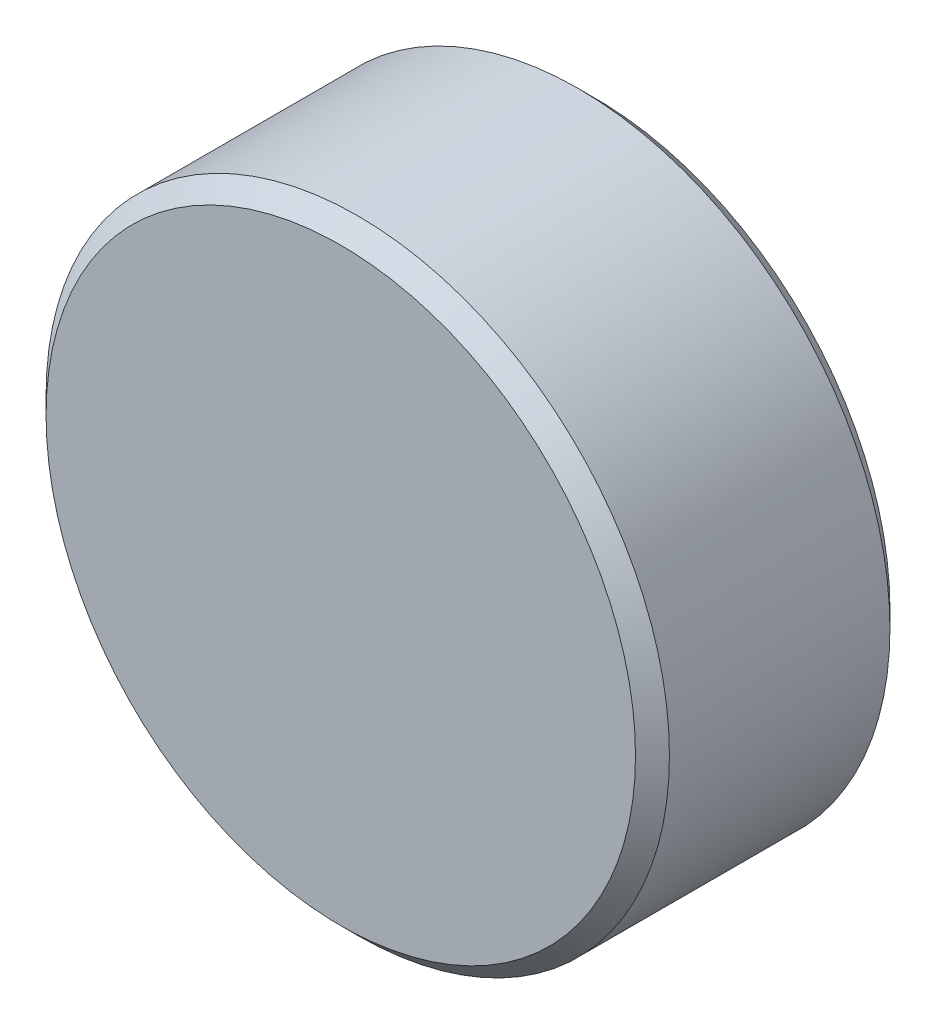
ISO-10303-21;
HEADER;
FILE_DESCRIPTION(('STEP AP214'),'2;1');
FILE_NAME('part.step','',(''),(''),'','','');
FILE_SCHEMA(('AUTOMOTIVE_DESIGN { 1 0 10303 214 1 1 1 1 }'));
ENDSEC;
DATA;
#1=APPLICATION_CONTEXT('core data for automotive mechanical design processes');
#2=APPLICATION_PROTOCOL_DEFINITION('international standard','automotive_design',2000,#1);
#3=PRODUCT_CONTEXT('',#1,'mechanical');
#4=PRODUCT('Part','Part','',(#3));
#5=PRODUCT_RELATED_PRODUCT_CATEGORY('part','',(#4));
#6=PRODUCT_DEFINITION_FORMATION('','',#4);
#7=PRODUCT_DEFINITION_CONTEXT('part definition',#1,'design');
#8=PRODUCT_DEFINITION('design','',#6,#7);
#9=PRODUCT_DEFINITION_SHAPE('','',#8);
#10=(LENGTH_UNIT() NAMED_UNIT(*) SI_UNIT(.MILLI.,.METRE.));
#11=(NAMED_UNIT(*) PLANE_ANGLE_UNIT() SI_UNIT($,.RADIAN.));
#12=(NAMED_UNIT(*) SI_UNIT($,.STERADIAN.) SOLID_ANGLE_UNIT());
#13=UNCERTAINTY_MEASURE_WITH_UNIT(LENGTH_MEASURE(1.E-05),#10,'distance_accuracy_value','');
#14=(GEOMETRIC_REPRESENTATION_CONTEXT(3) GLOBAL_UNCERTAINTY_ASSIGNED_CONTEXT((#13)) GLOBAL_UNIT_ASSIGNED_CONTEXT((#10,
#11,#12)) REPRESENTATION_CONTEXT('',''));
#15=CARTESIAN_POINT('',(0.,0.,0.));
#16=DIRECTION('',(0.,0.,1.));
#17=DIRECTION('',(1.,0.,0.));
#18=AXIS2_PLACEMENT_3D('',#15,#16,#17);
#19=CARTESIAN_POINT('',(0.,0.,30.));
#20=DIRECTION('',(0.,0.,-1.));
#21=DIRECTION('',(-1.,0.,0.));
#22=AXIS2_PLACEMENT_3D('',#19,#20,#21);
#23=CYLINDRICAL_SURFACE('',#22,36.75);
#24=CARTESIAN_POINT('',(0.,0.,2.00000000000001));
#25=DIRECTION('',(0.,0.,1.));
#26=DIRECTION('',(1.,0.,0.));
#27=AXIS2_PLACEMENT_3D('',#24,#25,#26);
#28=CIRCLE('',#27,36.75);
#29=CARTESIAN_POINT('',(36.75,0.,2.00000000000001));
#30=VERTEX_POINT('',#29);
#31=EDGE_CURVE('E35',#30,#30,#28,.T.);
#32=ORIENTED_EDGE('',*,*,#31,.T.);
#33=EDGE_LOOP('',(#32));
#34=FACE_BOUND('',#33,.T.);
#35=CARTESIAN_POINT('',(0.,0.,28.));
#36=DIRECTION('',(0.,0.,1.));
#37=DIRECTION('',(1.,0.,0.));
#38=AXIS2_PLACEMENT_3D('',#35,#36,#37);
#39=CIRCLE('',#38,36.75);
#40=CARTESIAN_POINT('',(36.75,0.,28.));
#41=VERTEX_POINT('',#40);
#42=EDGE_CURVE('E39',#41,#41,#39,.F.);
#43=ORIENTED_EDGE('',*,*,#42,.T.);
#44=EDGE_LOOP('',(#43));
#45=FACE_BOUND('',#44,.T.);
#46=ADVANCED_FACE('F28',(#34,#45),#23,.T.);
#47=CARTESIAN_POINT('',(0.,0.,30.));
#48=DIRECTION('',(0.,0.,1.));
#49=DIRECTION('',(1.,0.,0.));
#50=AXIS2_PLACEMENT_3D('',#47,#48,#49);
#51=PLANE('',#50);
#52=CARTESIAN_POINT('',(0.,0.,30.));
#53=DIRECTION('',(0.,0.,1.));
#54=DIRECTION('',(1.,0.,0.));
#55=AXIS2_PLACEMENT_3D('',#52,#53,#54);
#56=CIRCLE('',#55,34.75);
#57=CARTESIAN_POINT('',(34.75,0.,30.));
#58=VERTEX_POINT('',#57);
#59=EDGE_CURVE('E43',#58,#58,#56,.T.);
#60=ORIENTED_EDGE('',*,*,#59,.T.);
#61=EDGE_LOOP('',(#60));
#62=FACE_BOUND('',#61,.T.);
#63=ADVANCED_FACE('F49',(#62),#51,.T.);
#64=CARTESIAN_POINT('',(0.,0.,0.));
#65=DIRECTION('',(0.,0.,1.));
#66=DIRECTION('',(1.,0.,0.));
#67=AXIS2_PLACEMENT_3D('',#64,#65,#66);
#68=PLANE('',#67);
#69=CARTESIAN_POINT('',(0.,0.,0.));
#70=DIRECTION('',(0.,0.,1.));
#71=DIRECTION('',(1.,0.,0.));
#72=AXIS2_PLACEMENT_3D('',#69,#70,#71);
#73=CIRCLE('',#72,34.75);
#74=CARTESIAN_POINT('',(34.75,0.,0.));
#75=VERTEX_POINT('',#74);
#76=EDGE_CURVE('E10',#75,#75,#73,.F.);
#77=ORIENTED_EDGE('',*,*,#76,.T.);
#78=EDGE_LOOP('',(#77));
#79=FACE_BOUND('',#78,.T.);
#80=ADVANCED_FACE('F53',(#79),#68,.F.);
#81=CARTESIAN_POINT('',(0.,0.,30.));
#82=DIRECTION('',(0.,0.,-1.));
#83=DIRECTION('',(-1.,0.,0.));
#84=AXIS2_PLACEMENT_3D('',#81,#82,#83);
#85=CONICAL_SURFACE('',#84,34.75,0.785398163397441);
#86=ORIENTED_EDGE('',*,*,#42,.F.);
#87=EDGE_LOOP('',(#86));
#88=FACE_BOUND('',#87,.T.);
#89=ORIENTED_EDGE('',*,*,#59,.F.);
#90=EDGE_LOOP('',(#89));
#91=FACE_BOUND('',#90,.T.);
#92=ADVANCED_FACE('F51',(#88,#91),#85,.T.);
#93=CARTESIAN_POINT('',(0.,0.,2.00000000000001));
#94=DIRECTION('',(0.,0.,1.));
#95=DIRECTION('',(1.,0.,0.));
#96=AXIS2_PLACEMENT_3D('',#93,#94,#95);
#97=CONICAL_SURFACE('',#96,36.75,0.78539816339745);
#98=ORIENTED_EDGE('',*,*,#76,.F.);
#99=EDGE_LOOP('',(#98));
#100=FACE_BOUND('',#99,.T.);
#101=ORIENTED_EDGE('',*,*,#31,.F.);
#102=EDGE_LOOP('',(#101));
#103=FACE_BOUND('',#102,.T.);
#104=ADVANCED_FACE('F30',(#100,#103),#97,.T.);
#105=CLOSED_SHELL('',(#46,#63,#80,#92,#104));
#106=MANIFOLD_SOLID_BREP('B2',#105);
#107=ADVANCED_BREP_SHAPE_REPRESENTATION('',(#18,#106),#14);
#108=SHAPE_DEFINITION_REPRESENTATION(#9,#107);
ENDSEC;
END-ISO-10303-21;
